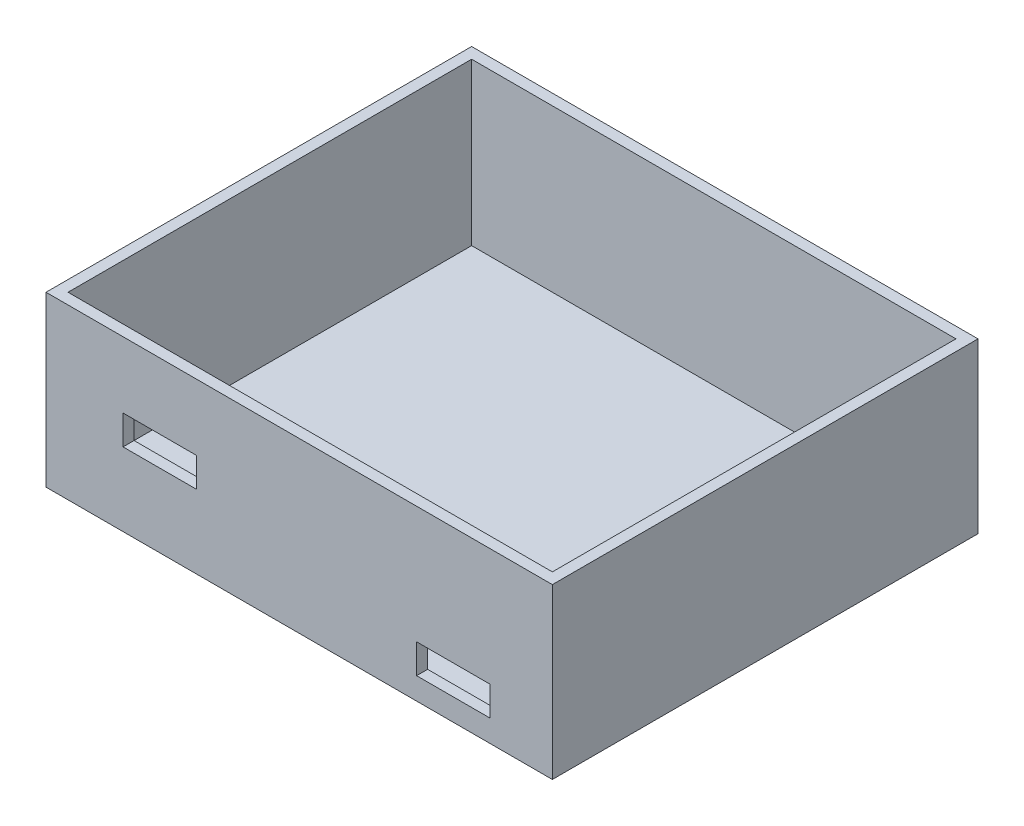
ISO-10303-21;
HEADER;
FILE_DESCRIPTION(('STEP AP214'),'2;1');
FILE_NAME('part.step','',(''),(''),'','','');
FILE_SCHEMA(('AUTOMOTIVE_DESIGN { 1 0 10303 214 1 1 1 1 }'));
ENDSEC;
DATA;
#1=APPLICATION_CONTEXT('core data for automotive mechanical design processes');
#2=APPLICATION_PROTOCOL_DEFINITION('international standard','automotive_design',2000,#1);
#3=PRODUCT_CONTEXT('',#1,'mechanical');
#4=PRODUCT('Part','Part','',(#3));
#5=PRODUCT_RELATED_PRODUCT_CATEGORY('part','',(#4));
#6=PRODUCT_DEFINITION_FORMATION('','',#4);
#7=PRODUCT_DEFINITION_CONTEXT('part definition',#1,'design');
#8=PRODUCT_DEFINITION('design','',#6,#7);
#9=PRODUCT_DEFINITION_SHAPE('','',#8);
#10=(LENGTH_UNIT() NAMED_UNIT(*) SI_UNIT(.MILLI.,.METRE.));
#11=(NAMED_UNIT(*) PLANE_ANGLE_UNIT() SI_UNIT($,.RADIAN.));
#12=(NAMED_UNIT(*) SI_UNIT($,.STERADIAN.) SOLID_ANGLE_UNIT());
#13=UNCERTAINTY_MEASURE_WITH_UNIT(LENGTH_MEASURE(1.E-05),#10,'distance_accuracy_value','');
#14=(GEOMETRIC_REPRESENTATION_CONTEXT(3) GLOBAL_UNCERTAINTY_ASSIGNED_CONTEXT((#13)) GLOBAL_UNIT_ASSIGNED_CONTEXT((#10,
#11,#12)) REPRESENTATION_CONTEXT('',''));
#15=CARTESIAN_POINT('',(0.,0.,0.));
#16=DIRECTION('',(0.,0.,1.));
#17=DIRECTION('',(1.,0.,0.));
#18=AXIS2_PLACEMENT_3D('',#15,#16,#17);
#19=CARTESIAN_POINT('',(0.,1.,0.));
#20=DIRECTION('',(0.,1.,0.));
#21=DIRECTION('',(0.,0.,1.));
#22=AXIS2_PLACEMENT_3D('',#19,#20,#21);
#23=PLANE('',#22);
#24=DIRECTION('',(1.,0.,0.));
#25=VECTOR('',#24,1.);
#26=CARTESIAN_POINT('',(0.,1.,28.5563333694351));
#27=LINE('',#26,#25);
#28=CARTESIAN_POINT('',(-33.571389819456,1.,28.5563333694351));
#29=VERTEX_POINT('',#28);
#30=CARTESIAN_POINT('',(32.428610180544,1.,28.5563333694351));
#31=VERTEX_POINT('',#30);
#32=EDGE_CURVE('E239',#29,#31,#27,.T.);
#33=ORIENTED_EDGE('',*,*,#32,.T.);
#34=DIRECTION('',(0.,0.,-1.));
#35=VECTOR('',#34,1.);
#36=CARTESIAN_POINT('',(32.428610180544,1.,0.));
#37=LINE('',#36,#35);
#38=CARTESIAN_POINT('',(32.428610180544,1.,-26.4436666305649));
#39=VERTEX_POINT('',#38);
#40=EDGE_CURVE('E234',#31,#39,#37,.T.);
#41=ORIENTED_EDGE('',*,*,#40,.T.);
#42=DIRECTION('',(-1.,0.,0.));
#43=VECTOR('',#42,1.);
#44=CARTESIAN_POINT('',(0.,1.,-26.4436666305649));
#45=LINE('',#44,#43);
#46=CARTESIAN_POINT('',(-33.571389819456,1.,-26.4436666305649));
#47=VERTEX_POINT('',#46);
#48=EDGE_CURVE('E236',#39,#47,#45,.T.);
#49=ORIENTED_EDGE('',*,*,#48,.T.);
#50=DIRECTION('',(0.,0.,-1.));
#51=VECTOR('',#50,1.);
#52=CARTESIAN_POINT('',(-33.571389819456,1.,0.));
#53=LINE('',#52,#51);
#54=EDGE_CURVE('E231',#29,#47,#53,.T.);
#55=ORIENTED_EDGE('',*,*,#54,.F.);
#56=EDGE_LOOP('',(#33,#41,#49,#55));
#57=FACE_BOUND('',#56,.T.);
#58=ADVANCED_FACE('F34',(#57),#23,.T.);
#59=CARTESIAN_POINT('',(32.428610180544,1.,0.));
#60=DIRECTION('',(1.,0.,0.));
#61=DIRECTION('',(0.,0.,-1.));
#62=AXIS2_PLACEMENT_3D('',#59,#60,#61);
#63=PLANE('',#62);
#64=ORIENTED_EDGE('',*,*,#40,.F.);
#65=DIRECTION('',(0.,-1.,0.));
#66=VECTOR('',#65,1.);
#67=CARTESIAN_POINT('',(32.428610180544,23.,28.5563333694351));
#68=LINE('',#67,#66);
#69=CARTESIAN_POINT('',(32.428610180544,23.,28.5563333694351));
#70=VERTEX_POINT('',#69);
#71=EDGE_CURVE('E199',#70,#31,#68,.T.);
#72=ORIENTED_EDGE('',*,*,#71,.F.);
#73=DIRECTION('',(0.,0.,1.));
#74=VECTOR('',#73,1.);
#75=CARTESIAN_POINT('',(32.428610180544,23.,0.));
#76=LINE('',#75,#74);
#77=CARTESIAN_POINT('',(32.428610180544,23.,-26.4436666305649));
#78=VERTEX_POINT('',#77);
#79=EDGE_CURVE('E207',#78,#70,#76,.T.);
#80=ORIENTED_EDGE('',*,*,#79,.F.);
#81=DIRECTION('',(0.,-1.,0.));
#82=VECTOR('',#81,1.);
#83=CARTESIAN_POINT('',(32.428610180544,23.,-26.4436666305649));
#84=LINE('',#83,#82);
#85=EDGE_CURVE('E228',#78,#39,#84,.T.);
#86=ORIENTED_EDGE('',*,*,#85,.T.);
#87=EDGE_LOOP('',(#64,#72,#80,#86));
#88=FACE_BOUND('',#87,.T.);
#89=ADVANCED_FACE('F36',(#88),#63,.F.);
#90=CARTESIAN_POINT('',(33.928610180544,1.,0.));
#91=DIRECTION('',(1.,0.,0.));
#92=DIRECTION('',(0.,0.,-1.));
#93=AXIS2_PLACEMENT_3D('',#90,#91,#92);
#94=PLANE('',#93);
#95=DIRECTION('',(0.,0.,1.));
#96=VECTOR('',#95,1.);
#97=CARTESIAN_POINT('',(33.928610180544,0.,0.));
#98=LINE('',#97,#96);
#99=CARTESIAN_POINT('',(33.928610180544,0.,-27.9436666305649));
#100=VERTEX_POINT('',#99);
#101=CARTESIAN_POINT('',(33.928610180544,0.,30.0563333694351));
#102=VERTEX_POINT('',#101);
#103=EDGE_CURVE('E238',#100,#102,#98,.T.);
#104=ORIENTED_EDGE('',*,*,#103,.F.);
#105=DIRECTION('',(0.,-1.,0.));
#106=VECTOR('',#105,1.);
#107=CARTESIAN_POINT('',(33.928610180544,1.,-27.9436666305649));
#108=LINE('',#107,#106);
#109=CARTESIAN_POINT('',(33.928610180544,23.,-27.9436666305649));
#110=VERTEX_POINT('',#109);
#111=EDGE_CURVE('E256',#110,#100,#108,.T.);
#112=ORIENTED_EDGE('',*,*,#111,.F.);
#113=DIRECTION('',(0.,0.,1.));
#114=VECTOR('',#113,1.);
#115=CARTESIAN_POINT('',(33.928610180544,23.,0.));
#116=LINE('',#115,#114);
#117=CARTESIAN_POINT('',(33.928610180544,23.,30.0563333694351));
#118=VERTEX_POINT('',#117);
#119=EDGE_CURVE('E213',#110,#118,#116,.T.);
#120=ORIENTED_EDGE('',*,*,#119,.T.);
#121=DIRECTION('',(0.,-1.,0.));
#122=VECTOR('',#121,1.);
#123=CARTESIAN_POINT('',(33.928610180544,1.,30.0563333694351));
#124=LINE('',#123,#122);
#125=EDGE_CURVE('E258',#118,#102,#124,.T.);
#126=ORIENTED_EDGE('',*,*,#125,.T.);
#127=EDGE_LOOP('',(#104,#112,#120,#126));
#128=FACE_BOUND('',#127,.T.);
#129=ADVANCED_FACE('F300',(#128),#94,.T.);
#130=CARTESIAN_POINT('',(0.,1.,-27.9436666305649));
#131=DIRECTION('',(0.,0.,-1.));
#132=DIRECTION('',(-1.,0.,0.));
#133=AXIS2_PLACEMENT_3D('',#130,#131,#132);
#134=PLANE('',#133);
#135=DIRECTION('',(1.,0.,0.));
#136=VECTOR('',#135,1.);
#137=CARTESIAN_POINT('',(0.,0.,-27.9436666305649));
#138=LINE('',#137,#136);
#139=CARTESIAN_POINT('',(-35.071389819456,0.,-27.9436666305649));
#140=VERTEX_POINT('',#139);
#141=EDGE_CURVE('E248',#140,#100,#138,.T.);
#142=ORIENTED_EDGE('',*,*,#141,.F.);
#143=DIRECTION('',(0.,-1.,0.));
#144=VECTOR('',#143,1.);
#145=CARTESIAN_POINT('',(-35.071389819456,1.,-27.9436666305649));
#146=LINE('',#145,#144);
#147=CARTESIAN_POINT('',(-35.071389819456,23.,-27.9436666305649));
#148=VERTEX_POINT('',#147);
#149=EDGE_CURVE('E254',#148,#140,#146,.T.);
#150=ORIENTED_EDGE('',*,*,#149,.F.);
#151=DIRECTION('',(1.,0.,0.));
#152=VECTOR('',#151,1.);
#153=CARTESIAN_POINT('',(0.,23.,-27.9436666305649));
#154=LINE('',#153,#152);
#155=EDGE_CURVE('E216',#148,#110,#154,.T.);
#156=ORIENTED_EDGE('',*,*,#155,.T.);
#157=ORIENTED_EDGE('',*,*,#111,.T.);
#158=EDGE_LOOP('',(#142,#150,#156,#157));
#159=FACE_BOUND('',#158,.T.);
#160=ADVANCED_FACE('F319',(#159),#134,.T.);
#161=CARTESIAN_POINT('',(-35.071389819456,1.,0.));
#162=DIRECTION('',(1.,0.,0.));
#163=DIRECTION('',(0.,0.,-1.));
#164=AXIS2_PLACEMENT_3D('',#161,#162,#163);
#165=PLANE('',#164);
#166=DIRECTION('',(0.,0.,1.));
#167=VECTOR('',#166,1.);
#168=CARTESIAN_POINT('',(-35.071389819456,0.,0.));
#169=LINE('',#168,#167);
#170=CARTESIAN_POINT('',(-35.071389819456,0.,30.0563333694351));
#171=VERTEX_POINT('',#170);
#172=EDGE_CURVE('E245',#140,#171,#169,.T.);
#173=ORIENTED_EDGE('',*,*,#172,.T.);
#174=DIRECTION('',(0.,-1.,0.));
#175=VECTOR('',#174,1.);
#176=CARTESIAN_POINT('',(-35.071389819456,1.,30.0563333694351));
#177=LINE('',#176,#175);
#178=CARTESIAN_POINT('',(-35.071389819456,23.,30.0563333694351));
#179=VERTEX_POINT('',#178);
#180=EDGE_CURVE('E242',#179,#171,#177,.T.);
#181=ORIENTED_EDGE('',*,*,#180,.F.);
#182=DIRECTION('',(0.,0.,1.));
#183=VECTOR('',#182,1.);
#184=CARTESIAN_POINT('',(-35.071389819456,23.,0.));
#185=LINE('',#184,#183);
#186=EDGE_CURVE('E219',#148,#179,#185,.T.);
#187=ORIENTED_EDGE('',*,*,#186,.F.);
#188=ORIENTED_EDGE('',*,*,#149,.T.);
#189=EDGE_LOOP('',(#173,#181,#187,#188));
#190=FACE_BOUND('',#189,.T.);
#191=ADVANCED_FACE('F316',(#190),#165,.F.);
#192=CARTESIAN_POINT('',(0.,1.,30.0563333694351));
#193=DIRECTION('',(0.,0.,-1.));
#194=DIRECTION('',(-1.,0.,0.));
#195=AXIS2_PLACEMENT_3D('',#192,#193,#194);
#196=PLANE('',#195);
#197=DIRECTION('',(1.,0.,0.));
#198=VECTOR('',#197,1.);
#199=CARTESIAN_POINT('',(25.428610180544,3.,30.0563333694351));
#200=LINE('',#199,#198);
#201=CARTESIAN_POINT('',(15.428610180544,3.,30.0563333694351));
#202=VERTEX_POINT('',#201);
#203=CARTESIAN_POINT('',(25.428610180544,3.,30.0563333694351));
#204=VERTEX_POINT('',#203);
#205=EDGE_CURVE('E163',#202,#204,#200,.T.);
#206=ORIENTED_EDGE('',*,*,#205,.F.);
#207=DIRECTION('',(0.,-1.,0.));
#208=VECTOR('',#207,1.);
#209=CARTESIAN_POINT('',(15.428610180544,3.,30.0563333694351));
#210=LINE('',#209,#208);
#211=CARTESIAN_POINT('',(15.428610180544,7.,30.0563333694351));
#212=VERTEX_POINT('',#211);
#213=EDGE_CURVE('E49',#212,#202,#210,.T.);
#214=ORIENTED_EDGE('',*,*,#213,.F.);
#215=DIRECTION('',(-1.,0.,0.));
#216=VECTOR('',#215,1.);
#217=CARTESIAN_POINT('',(25.428610180544,7.,30.0563333694351));
#218=LINE('',#217,#216);
#219=CARTESIAN_POINT('',(25.428610180544,7.,30.0563333694351));
#220=VERTEX_POINT('',#219);
#221=EDGE_CURVE('E170',#220,#212,#218,.T.);
#222=ORIENTED_EDGE('',*,*,#221,.F.);
#223=DIRECTION('',(0.,1.,0.));
#224=VECTOR('',#223,1.);
#225=CARTESIAN_POINT('',(25.428610180544,3.,30.0563333694351));
#226=LINE('',#225,#224);
#227=EDGE_CURVE('E153',#204,#220,#226,.T.);
#228=ORIENTED_EDGE('',*,*,#227,.F.);
#229=EDGE_LOOP('',(#206,#214,#222,#228));
#230=FACE_BOUND('',#229,.T.);
#231=DIRECTION('',(-1.,0.,0.));
#232=VECTOR('',#231,1.);
#233=CARTESIAN_POINT('',(-24.571389819456,14.,30.0563333694351));
#234=LINE('',#233,#232);
#235=CARTESIAN_POINT('',(-14.571389819456,14.,30.0563333694351));
#236=VERTEX_POINT('',#235);
#237=CARTESIAN_POINT('',(-24.571389819456,14.,30.0563333694351));
#238=VERTEX_POINT('',#237);
#239=EDGE_CURVE('E181',#236,#238,#234,.T.);
#240=ORIENTED_EDGE('',*,*,#239,.F.);
#241=DIRECTION('',(0.,1.,0.));
#242=VECTOR('',#241,1.);
#243=CARTESIAN_POINT('',(-14.571389819456,14.,30.0563333694351));
#244=LINE('',#243,#242);
#245=CARTESIAN_POINT('',(-14.571389819456,10.,30.0563333694351));
#246=VERTEX_POINT('',#245);
#247=EDGE_CURVE('E57',#246,#236,#244,.T.);
#248=ORIENTED_EDGE('',*,*,#247,.F.);
#249=DIRECTION('',(1.,0.,0.));
#250=VECTOR('',#249,1.);
#251=CARTESIAN_POINT('',(-24.571389819456,10.,30.0563333694351));
#252=LINE('',#251,#250);
#253=CARTESIAN_POINT('',(-24.571389819456,10.,30.0563333694351));
#254=VERTEX_POINT('',#253);
#255=EDGE_CURVE('E187',#254,#246,#252,.T.);
#256=ORIENTED_EDGE('',*,*,#255,.F.);
#257=DIRECTION('',(0.,-1.,0.));
#258=VECTOR('',#257,1.);
#259=CARTESIAN_POINT('',(-24.571389819456,14.,30.0563333694351));
#260=LINE('',#259,#258);
#261=EDGE_CURVE('E184',#238,#254,#260,.T.);
#262=ORIENTED_EDGE('',*,*,#261,.F.);
#263=EDGE_LOOP('',(#240,#248,#256,#262));
#264=FACE_BOUND('',#263,.T.);
#265=DIRECTION('',(1.,0.,0.));
#266=VECTOR('',#265,1.);
#267=CARTESIAN_POINT('',(0.,0.,30.0563333694351));
#268=LINE('',#267,#266);
#269=EDGE_CURVE('E243',#171,#102,#268,.T.);
#270=ORIENTED_EDGE('',*,*,#269,.T.);
#271=ORIENTED_EDGE('',*,*,#125,.F.);
#272=DIRECTION('',(1.,0.,0.));
#273=VECTOR('',#272,1.);
#274=CARTESIAN_POINT('',(0.,23.,30.0563333694351));
#275=LINE('',#274,#273);
#276=EDGE_CURVE('E210',#179,#118,#275,.T.);
#277=ORIENTED_EDGE('',*,*,#276,.F.);
#278=ORIENTED_EDGE('',*,*,#180,.T.);
#279=EDGE_LOOP('',(#270,#271,#277,#278));
#280=FACE_BOUND('',#279,.T.);
#281=ADVANCED_FACE('F167',(#230,#264,#280),#196,.F.);
#282=CARTESIAN_POINT('',(-33.571389819456,1.,0.));
#283=DIRECTION('',(1.,0.,0.));
#284=DIRECTION('',(0.,0.,-1.));
#285=AXIS2_PLACEMENT_3D('',#282,#283,#284);
#286=PLANE('',#285);
#287=DIRECTION('',(0.,-1.,0.));
#288=VECTOR('',#287,1.);
#289=CARTESIAN_POINT('',(-33.571389819456,23.,28.5563333694351));
#290=LINE('',#289,#288);
#291=CARTESIAN_POINT('',(-33.571389819456,23.,28.5563333694351));
#292=VERTEX_POINT('',#291);
#293=EDGE_CURVE('E201',#292,#29,#290,.T.);
#294=ORIENTED_EDGE('',*,*,#293,.T.);
#295=ORIENTED_EDGE('',*,*,#54,.T.);
#296=DIRECTION('',(0.,-1.,0.));
#297=VECTOR('',#296,1.);
#298=CARTESIAN_POINT('',(-33.571389819456,23.,-26.4436666305649));
#299=LINE('',#298,#297);
#300=CARTESIAN_POINT('',(-33.571389819456,23.,-26.4436666305649));
#301=VERTEX_POINT('',#300);
#302=EDGE_CURVE('E225',#301,#47,#299,.T.);
#303=ORIENTED_EDGE('',*,*,#302,.F.);
#304=DIRECTION('',(0.,0.,1.));
#305=VECTOR('',#304,1.);
#306=CARTESIAN_POINT('',(-33.571389819456,23.,0.));
#307=LINE('',#306,#305);
#308=EDGE_CURVE('E222',#301,#292,#307,.T.);
#309=ORIENTED_EDGE('',*,*,#308,.T.);
#310=EDGE_LOOP('',(#294,#295,#303,#309));
#311=FACE_BOUND('',#310,.T.);
#312=ADVANCED_FACE('F309',(#311),#286,.T.);
#313=CARTESIAN_POINT('',(0.,0.,0.));
#314=DIRECTION('',(0.,1.,0.));
#315=DIRECTION('',(0.,0.,1.));
#316=AXIS2_PLACEMENT_3D('',#313,#314,#315);
#317=PLANE('',#316);
#318=ORIENTED_EDGE('',*,*,#103,.T.);
#319=ORIENTED_EDGE('',*,*,#269,.F.);
#320=ORIENTED_EDGE('',*,*,#172,.F.);
#321=ORIENTED_EDGE('',*,*,#141,.T.);
#322=EDGE_LOOP('',(#318,#319,#320,#321));
#323=FACE_BOUND('',#322,.T.);
#324=ADVANCED_FACE('F306',(#323),#317,.F.);
#325=CARTESIAN_POINT('',(0.,23.,-26.4436666305649));
#326=DIRECTION('',(0.,0.,-1.));
#327=DIRECTION('',(-1.,0.,0.));
#328=AXIS2_PLACEMENT_3D('',#325,#326,#327);
#329=PLANE('',#328);
#330=ORIENTED_EDGE('',*,*,#48,.F.);
#331=ORIENTED_EDGE('',*,*,#85,.F.);
#332=DIRECTION('',(1.,0.,0.));
#333=VECTOR('',#332,1.);
#334=CARTESIAN_POINT('',(0.,23.,-26.4436666305649));
#335=LINE('',#334,#333);
#336=EDGE_CURVE('E204',#301,#78,#335,.T.);
#337=ORIENTED_EDGE('',*,*,#336,.F.);
#338=ORIENTED_EDGE('',*,*,#302,.T.);
#339=EDGE_LOOP('',(#330,#331,#337,#338));
#340=FACE_BOUND('',#339,.T.);
#341=ADVANCED_FACE('F304',(#340),#329,.F.);
#342=CARTESIAN_POINT('',(0.,23.,0.));
#343=DIRECTION('',(0.,1.,0.));
#344=DIRECTION('',(0.,0.,1.));
#345=AXIS2_PLACEMENT_3D('',#342,#343,#344);
#346=PLANE('',#345);
#347=ORIENTED_EDGE('',*,*,#186,.T.);
#348=ORIENTED_EDGE('',*,*,#276,.T.);
#349=ORIENTED_EDGE('',*,*,#119,.F.);
#350=ORIENTED_EDGE('',*,*,#155,.F.);
#351=EDGE_LOOP('',(#347,#348,#349,#350));
#352=FACE_BOUND('',#351,.T.);
#353=ORIENTED_EDGE('',*,*,#336,.T.);
#354=ORIENTED_EDGE('',*,*,#79,.T.);
#355=DIRECTION('',(1.,0.,0.));
#356=VECTOR('',#355,1.);
#357=CARTESIAN_POINT('',(0.,23.,28.5563333694351));
#358=LINE('',#357,#356);
#359=EDGE_CURVE('E177',#292,#70,#358,.T.);
#360=ORIENTED_EDGE('',*,*,#359,.F.);
#361=ORIENTED_EDGE('',*,*,#308,.F.);
#362=EDGE_LOOP('',(#353,#354,#360,#361));
#363=FACE_BOUND('',#362,.T.);
#364=ADVANCED_FACE('F335',(#352,#363),#346,.T.);
#365=CARTESIAN_POINT('',(0.,23.,28.5563333694351));
#366=DIRECTION('',(0.,0.,-1.));
#367=DIRECTION('',(-1.,0.,0.));
#368=AXIS2_PLACEMENT_3D('',#365,#366,#367);
#369=PLANE('',#368);
#370=DIRECTION('',(0.,1.,0.));
#371=VECTOR('',#370,1.);
#372=CARTESIAN_POINT('',(15.428610180544,23.,28.5563333694351));
#373=LINE('',#372,#371);
#374=CARTESIAN_POINT('',(15.428610180544,3.,28.5563333694351));
#375=VERTEX_POINT('',#374);
#376=CARTESIAN_POINT('',(15.428610180544,7.,28.5563333694351));
#377=VERTEX_POINT('',#376);
#378=EDGE_CURVE('E11',#375,#377,#373,.T.);
#379=ORIENTED_EDGE('',*,*,#378,.F.);
#380=DIRECTION('',(-1.,0.,0.));
#381=VECTOR('',#380,1.);
#382=CARTESIAN_POINT('',(0.,3.,28.5563333694351));
#383=LINE('',#382,#381);
#384=CARTESIAN_POINT('',(25.428610180544,3.,28.5563333694351));
#385=VERTEX_POINT('',#384);
#386=EDGE_CURVE('E270',#385,#375,#383,.T.);
#387=ORIENTED_EDGE('',*,*,#386,.F.);
#388=DIRECTION('',(0.,-1.,0.));
#389=VECTOR('',#388,1.);
#390=CARTESIAN_POINT('',(25.428610180544,23.,28.5563333694351));
#391=LINE('',#390,#389);
#392=CARTESIAN_POINT('',(25.428610180544,7.,28.5563333694351));
#393=VERTEX_POINT('',#392);
#394=EDGE_CURVE('E156',#393,#385,#391,.T.);
#395=ORIENTED_EDGE('',*,*,#394,.F.);
#396=DIRECTION('',(1.,0.,0.));
#397=VECTOR('',#396,1.);
#398=CARTESIAN_POINT('',(0.,7.,28.5563333694351));
#399=LINE('',#398,#397);
#400=EDGE_CURVE('E42',#377,#393,#399,.T.);
#401=ORIENTED_EDGE('',*,*,#400,.F.);
#402=EDGE_LOOP('',(#379,#387,#395,#401));
#403=FACE_BOUND('',#402,.T.);
#404=DIRECTION('',(0.,-1.,0.));
#405=VECTOR('',#404,1.);
#406=CARTESIAN_POINT('',(-14.571389819456,23.,28.5563333694351));
#407=LINE('',#406,#405);
#408=CARTESIAN_POINT('',(-14.571389819456,14.,28.5563333694351));
#409=VERTEX_POINT('',#408);
#410=CARTESIAN_POINT('',(-14.571389819456,10.,28.5563333694351));
#411=VERTEX_POINT('',#410);
#412=EDGE_CURVE('E268',#409,#411,#407,.T.);
#413=ORIENTED_EDGE('',*,*,#412,.F.);
#414=DIRECTION('',(1.,0.,0.));
#415=VECTOR('',#414,1.);
#416=CARTESIAN_POINT('',(0.,14.,28.5563333694351));
#417=LINE('',#416,#415);
#418=CARTESIAN_POINT('',(-24.571389819456,14.,28.5563333694351));
#419=VERTEX_POINT('',#418);
#420=EDGE_CURVE('E261',#419,#409,#417,.T.);
#421=ORIENTED_EDGE('',*,*,#420,.F.);
#422=DIRECTION('',(0.,1.,0.));
#423=VECTOR('',#422,1.);
#424=CARTESIAN_POINT('',(-24.571389819456,23.,28.5563333694351));
#425=LINE('',#424,#423);
#426=CARTESIAN_POINT('',(-24.571389819456,10.,28.5563333694351));
#427=VERTEX_POINT('',#426);
#428=EDGE_CURVE('E263',#427,#419,#425,.T.);
#429=ORIENTED_EDGE('',*,*,#428,.F.);
#430=DIRECTION('',(-1.,0.,0.));
#431=VECTOR('',#430,1.);
#432=CARTESIAN_POINT('',(0.,10.,28.5563333694351));
#433=LINE('',#432,#431);
#434=EDGE_CURVE('E266',#411,#427,#433,.T.);
#435=ORIENTED_EDGE('',*,*,#434,.F.);
#436=EDGE_LOOP('',(#413,#421,#429,#435));
#437=FACE_BOUND('',#436,.T.);
#438=ORIENTED_EDGE('',*,*,#71,.T.);
#439=ORIENTED_EDGE('',*,*,#32,.F.);
#440=ORIENTED_EDGE('',*,*,#293,.F.);
#441=ORIENTED_EDGE('',*,*,#359,.T.);
#442=EDGE_LOOP('',(#438,#439,#440,#441));
#443=FACE_BOUND('',#442,.T.);
#444=ADVANCED_FACE('F278',(#403,#437,#443),#369,.T.);
#445=CARTESIAN_POINT('',(-14.571389819456,14.,20.0563333694351));
#446=DIRECTION('',(1.,0.,0.));
#447=DIRECTION('',(0.,0.,-1.));
#448=AXIS2_PLACEMENT_3D('',#445,#446,#447);
#449=PLANE('',#448);
#450=ORIENTED_EDGE('',*,*,#412,.T.);
#451=DIRECTION('',(0.,0.,1.));
#452=VECTOR('',#451,1.);
#453=CARTESIAN_POINT('',(-14.571389819456,10.,20.0563333694351));
#454=LINE('',#453,#452);
#455=EDGE_CURVE('E191',#411,#246,#454,.T.);
#456=ORIENTED_EDGE('',*,*,#455,.T.);
#457=ORIENTED_EDGE('',*,*,#247,.T.);
#458=DIRECTION('',(0.,0.,1.));
#459=VECTOR('',#458,1.);
#460=CARTESIAN_POINT('',(-14.571389819456,14.,20.0563333694351));
#461=LINE('',#460,#459);
#462=EDGE_CURVE('E190',#409,#236,#461,.T.);
#463=ORIENTED_EDGE('',*,*,#462,.F.);
#464=EDGE_LOOP('',(#450,#456,#457,#463));
#465=FACE_BOUND('',#464,.T.);
#466=ADVANCED_FACE('F351',(#465),#449,.F.);
#467=CARTESIAN_POINT('',(-24.571389819456,10.,20.0563333694351));
#468=DIRECTION('',(0.,-1.,0.));
#469=DIRECTION('',(0.,0.,-1.));
#470=AXIS2_PLACEMENT_3D('',#467,#468,#469);
#471=PLANE('',#470);
#472=ORIENTED_EDGE('',*,*,#434,.T.);
#473=DIRECTION('',(0.,0.,1.));
#474=VECTOR('',#473,1.);
#475=CARTESIAN_POINT('',(-24.571389819456,10.,20.0563333694351));
#476=LINE('',#475,#474);
#477=EDGE_CURVE('E193',#427,#254,#476,.T.);
#478=ORIENTED_EDGE('',*,*,#477,.T.);
#479=ORIENTED_EDGE('',*,*,#255,.T.);
#480=ORIENTED_EDGE('',*,*,#455,.F.);
#481=EDGE_LOOP('',(#472,#478,#479,#480));
#482=FACE_BOUND('',#481,.T.);
#483=ADVANCED_FACE('F356',(#482),#471,.F.);
#484=CARTESIAN_POINT('',(-24.571389819456,14.,20.0563333694351));
#485=DIRECTION('',(-1.,0.,0.));
#486=DIRECTION('',(0.,-1.,0.));
#487=AXIS2_PLACEMENT_3D('',#484,#485,#486);
#488=PLANE('',#487);
#489=ORIENTED_EDGE('',*,*,#428,.T.);
#490=DIRECTION('',(0.,0.,1.));
#491=VECTOR('',#490,1.);
#492=CARTESIAN_POINT('',(-24.571389819456,14.,20.0563333694351));
#493=LINE('',#492,#491);
#494=EDGE_CURVE('E195',#419,#238,#493,.T.);
#495=ORIENTED_EDGE('',*,*,#494,.T.);
#496=ORIENTED_EDGE('',*,*,#261,.T.);
#497=ORIENTED_EDGE('',*,*,#477,.F.);
#498=EDGE_LOOP('',(#489,#495,#496,#497));
#499=FACE_BOUND('',#498,.T.);
#500=ADVANCED_FACE('F289',(#499),#488,.F.);
#501=CARTESIAN_POINT('',(-24.571389819456,14.,20.0563333694351));
#502=DIRECTION('',(0.,1.,0.));
#503=DIRECTION('',(0.,0.,1.));
#504=AXIS2_PLACEMENT_3D('',#501,#502,#503);
#505=PLANE('',#504);
#506=ORIENTED_EDGE('',*,*,#420,.T.);
#507=ORIENTED_EDGE('',*,*,#462,.T.);
#508=ORIENTED_EDGE('',*,*,#239,.T.);
#509=ORIENTED_EDGE('',*,*,#494,.F.);
#510=EDGE_LOOP('',(#506,#507,#508,#509));
#511=FACE_BOUND('',#510,.T.);
#512=ADVANCED_FACE('F282',(#511),#505,.F.);
#513=CARTESIAN_POINT('',(15.428610180544,3.,20.0563333694351));
#514=DIRECTION('',(-1.,0.,0.));
#515=DIRECTION('',(0.,0.,1.));
#516=AXIS2_PLACEMENT_3D('',#513,#514,#515);
#517=PLANE('',#516);
#518=ORIENTED_EDGE('',*,*,#378,.T.);
#519=DIRECTION('',(0.,0.,1.));
#520=VECTOR('',#519,1.);
#521=CARTESIAN_POINT('',(15.428610180544,7.,20.0563333694351));
#522=LINE('',#521,#520);
#523=EDGE_CURVE('E175',#377,#212,#522,.T.);
#524=ORIENTED_EDGE('',*,*,#523,.T.);
#525=ORIENTED_EDGE('',*,*,#213,.T.);
#526=DIRECTION('',(0.,0.,1.));
#527=VECTOR('',#526,1.);
#528=CARTESIAN_POINT('',(15.428610180544,3.,20.0563333694351));
#529=LINE('',#528,#527);
#530=EDGE_CURVE('E160',#375,#202,#529,.T.);
#531=ORIENTED_EDGE('',*,*,#530,.F.);
#532=EDGE_LOOP('',(#518,#524,#525,#531));
#533=FACE_BOUND('',#532,.T.);
#534=ADVANCED_FACE('F280',(#533),#517,.F.);
#535=CARTESIAN_POINT('',(25.428610180544,7.,20.0563333694351));
#536=DIRECTION('',(0.,1.,0.));
#537=DIRECTION('',(-1.,0.,0.));
#538=AXIS2_PLACEMENT_3D('',#535,#536,#537);
#539=PLANE('',#538);
#540=ORIENTED_EDGE('',*,*,#400,.T.);
#541=DIRECTION('',(0.,0.,1.));
#542=VECTOR('',#541,1.);
#543=CARTESIAN_POINT('',(25.428610180544,7.,20.0563333694351));
#544=LINE('',#543,#542);
#545=EDGE_CURVE('E159',#393,#220,#544,.T.);
#546=ORIENTED_EDGE('',*,*,#545,.T.);
#547=ORIENTED_EDGE('',*,*,#221,.T.);
#548=ORIENTED_EDGE('',*,*,#523,.F.);
#549=EDGE_LOOP('',(#540,#546,#547,#548));
#550=FACE_BOUND('',#549,.T.);
#551=ADVANCED_FACE('F275',(#550),#539,.F.);
#552=CARTESIAN_POINT('',(25.428610180544,3.,20.0563333694351));
#553=DIRECTION('',(1.,0.,0.));
#554=DIRECTION('',(0.,0.,-1.));
#555=AXIS2_PLACEMENT_3D('',#552,#553,#554);
#556=PLANE('',#555);
#557=ORIENTED_EDGE('',*,*,#394,.T.);
#558=DIRECTION('',(0.,0.,1.));
#559=VECTOR('',#558,1.);
#560=CARTESIAN_POINT('',(25.428610180544,3.,20.0563333694351));
#561=LINE('',#560,#559);
#562=EDGE_CURVE('E148',#385,#204,#561,.T.);
#563=ORIENTED_EDGE('',*,*,#562,.T.);
#564=ORIENTED_EDGE('',*,*,#227,.T.);
#565=ORIENTED_EDGE('',*,*,#545,.F.);
#566=EDGE_LOOP('',(#557,#563,#564,#565));
#567=FACE_BOUND('',#566,.T.);
#568=ADVANCED_FACE('F150',(#567),#556,.F.);
#569=CARTESIAN_POINT('',(25.428610180544,3.,20.0563333694351));
#570=DIRECTION('',(0.,-1.,0.));
#571=DIRECTION('',(1.,0.,0.));
#572=AXIS2_PLACEMENT_3D('',#569,#570,#571);
#573=PLANE('',#572);
#574=ORIENTED_EDGE('',*,*,#386,.T.);
#575=ORIENTED_EDGE('',*,*,#530,.T.);
#576=ORIENTED_EDGE('',*,*,#205,.T.);
#577=ORIENTED_EDGE('',*,*,#562,.F.);
#578=EDGE_LOOP('',(#574,#575,#576,#577));
#579=FACE_BOUND('',#578,.T.);
#580=ADVANCED_FACE('F164',(#579),#573,.F.);
#581=CLOSED_SHELL('',(#58,#89,#129,#160,#191,#281,#312,#324,#341,#364,#444,#466,#483,#500,#512,
#534,#551,#568,#580));
#582=MANIFOLD_SOLID_BREP('B2',#581);
#583=ADVANCED_BREP_SHAPE_REPRESENTATION('',(#18,#582),#14);
#584=SHAPE_DEFINITION_REPRESENTATION(#9,#583);
ENDSEC;
END-ISO-10303-21;
